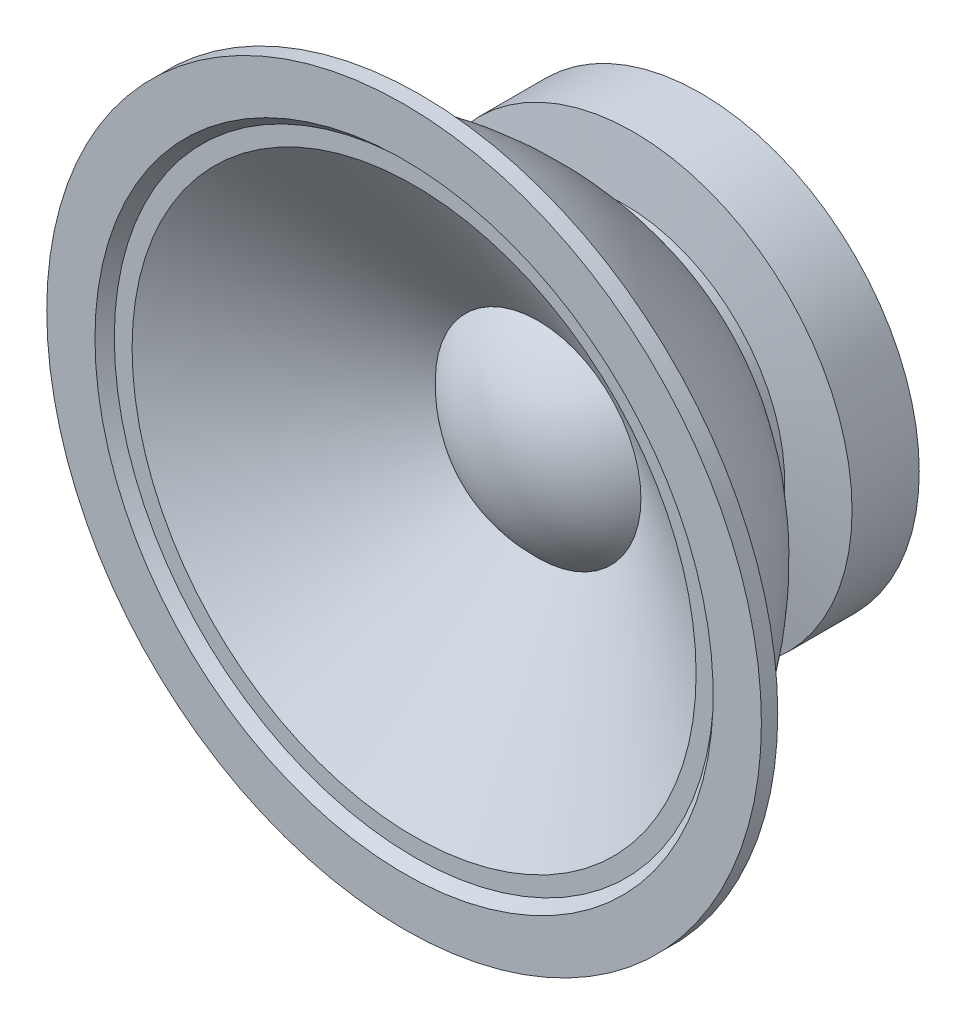
ISO-10303-21;
HEADER;
FILE_DESCRIPTION(('STEP AP214'),'2;1');
FILE_NAME('part.step','',(''),(''),'','','');
FILE_SCHEMA(('AUTOMOTIVE_DESIGN { 1 0 10303 214 1 1 1 1 }'));
ENDSEC;
DATA;
#1=APPLICATION_CONTEXT('core data for automotive mechanical design processes');
#2=APPLICATION_PROTOCOL_DEFINITION('international standard','automotive_design',2000,#1);
#3=PRODUCT_CONTEXT('',#1,'mechanical');
#4=PRODUCT('Part','Part','',(#3));
#5=PRODUCT_RELATED_PRODUCT_CATEGORY('part','',(#4));
#6=PRODUCT_DEFINITION_FORMATION('','',#4);
#7=PRODUCT_DEFINITION_CONTEXT('part definition',#1,'design');
#8=PRODUCT_DEFINITION('design','',#6,#7);
#9=PRODUCT_DEFINITION_SHAPE('','',#8);
#10=(LENGTH_UNIT() NAMED_UNIT(*) SI_UNIT(.MILLI.,.METRE.));
#11=(NAMED_UNIT(*) PLANE_ANGLE_UNIT() SI_UNIT($,.RADIAN.));
#12=(NAMED_UNIT(*) SI_UNIT($,.STERADIAN.) SOLID_ANGLE_UNIT());
#13=UNCERTAINTY_MEASURE_WITH_UNIT(LENGTH_MEASURE(1.E-05),#10,'distance_accuracy_value','');
#14=(GEOMETRIC_REPRESENTATION_CONTEXT(3) GLOBAL_UNCERTAINTY_ASSIGNED_CONTEXT((#13)) GLOBAL_UNIT_ASSIGNED_CONTEXT((#10,
#11,#12)) REPRESENTATION_CONTEXT('',''));
#15=CARTESIAN_POINT('',(0.,0.,0.));
#16=DIRECTION('',(0.,0.,1.));
#17=DIRECTION('',(1.,0.,0.));
#18=AXIS2_PLACEMENT_3D('',#15,#16,#17);
#19=CARTESIAN_POINT('',(0.,0.,-173.99));
#20=DIRECTION('',(0.,0.,1.));
#21=DIRECTION('',(1.,0.,0.));
#22=AXIS2_PLACEMENT_3D('',#19,#20,#21);
#23=PLANE('',#22);
#24=CARTESIAN_POINT('',(0.,0.,-173.99));
#25=DIRECTION('',(0.,0.,-1.));
#26=DIRECTION('',(-1.,0.,0.));
#27=AXIS2_PLACEMENT_3D('',#24,#25,#26);
#28=CIRCLE('',#27,34.441352467445);
#29=CARTESIAN_POINT('',(34.4413524674449,0.,-173.99));
#30=VERTEX_POINT('',#29);
#31=EDGE_CURVE('E10',#30,#30,#28,.T.);
#32=ORIENTED_EDGE('',*,*,#31,.T.);
#33=EDGE_LOOP('',(#32));
#34=FACE_BOUND('',#33,.T.);
#35=ADVANCED_FACE('F37',(#34),#23,.F.);
#36=CARTESIAN_POINT('',(0.,0.,-163.445094543552));
#37=DIRECTION('',(0.,0.,1.));
#38=DIRECTION('',(1.,0.,0.));
#39=AXIS2_PLACEMENT_3D('',#36,#37,#38);
#40=CONICAL_SURFACE('',#39,120.362804334795,1.44867971687013);
#41=CARTESIAN_POINT('',(0.,0.,-163.445094543552));
#42=DIRECTION('',(0.,0.,-1.));
#43=DIRECTION('',(-1.,0.,0.));
#44=AXIS2_PLACEMENT_3D('',#41,#42,#43);
#45=CIRCLE('',#44,120.362804334795);
#46=CARTESIAN_POINT('',(120.362804334795,0.,-163.445094543552));
#47=VERTEX_POINT('',#46);
#48=EDGE_CURVE('E44',#47,#47,#45,.T.);
#49=CARTESIAN_POINT('',(34.4413524674449,0.,-173.99));
#50=CARTESIAN_POINT('',(35.3363675910631,0.,-173.880157234829));
#51=CARTESIAN_POINT('',(36.2313827146814,0.,-173.770314469657));
#52=CARTESIAN_POINT('',(38.0214129619178,0.,-173.550628939315));
#53=CARTESIAN_POINT('',(38.916428085536,0.,-173.440786174143));
#54=CARTESIAN_POINT('',(40.7064583327725,0.,-173.221100643801));
#55=CARTESIAN_POINT('',(41.6014734563907,0.,-173.111257878629));
#56=CARTESIAN_POINT('',(43.3915037036272,0.,-172.891572348287));
#57=CARTESIAN_POINT('',(44.2865188272454,0.,-172.781729583115));
#58=CARTESIAN_POINT('',(46.0765490744819,0.,-172.562044052773));
#59=CARTESIAN_POINT('',(46.9715641981001,0.,-172.452201287601));
#60=CARTESIAN_POINT('',(48.7615944453366,0.,-172.232515757259));
#61=CARTESIAN_POINT('',(49.6566095689548,0.,-172.122672992087));
#62=CARTESIAN_POINT('',(51.4466398161913,0.,-171.902987461745));
#63=CARTESIAN_POINT('',(52.3416549398095,0.,-171.793144696573));
#64=CARTESIAN_POINT('',(54.131685187046,0.,-171.573459166231));
#65=CARTESIAN_POINT('',(55.0267003106642,0.,-171.463616401059));
#66=CARTESIAN_POINT('',(56.8167305579007,0.,-171.243930870717));
#67=CARTESIAN_POINT('',(57.7117456815189,0.,-171.134088105545));
#68=CARTESIAN_POINT('',(59.5017759287554,0.,-170.914402575203));
#69=CARTESIAN_POINT('',(60.3967910523736,0.,-170.804559810031));
#70=CARTESIAN_POINT('',(62.18682129961,0.,-170.584874279689));
#71=CARTESIAN_POINT('',(63.0818364232283,0.,-170.475031514518));
#72=CARTESIAN_POINT('',(64.8718666704647,0.,-170.255345984175));
#73=CARTESIAN_POINT('',(65.766881794083,0.,-170.145503219004));
#74=CARTESIAN_POINT('',(67.5569120413194,0.,-169.925817688661));
#75=CARTESIAN_POINT('',(68.4519271649377,0.,-169.81597492349));
#76=CARTESIAN_POINT('',(70.2419574121741,0.,-169.596289393147));
#77=CARTESIAN_POINT('',(71.1369725357924,0.,-169.486446627976));
#78=CARTESIAN_POINT('',(72.9270027830288,0.,-169.266761097633));
#79=CARTESIAN_POINT('',(73.822017906647,0.,-169.156918332462));
#80=CARTESIAN_POINT('',(75.6120481538835,0.,-168.937232802119));
#81=CARTESIAN_POINT('',(76.5070632775017,0.,-168.827390036948));
#82=CARTESIAN_POINT('',(78.2970935247382,0.,-168.607704506605));
#83=CARTESIAN_POINT('',(79.1921086483564,0.,-168.497861741434));
#84=CARTESIAN_POINT('',(80.9821388955929,0.,-168.278176211091));
#85=CARTESIAN_POINT('',(81.8771540192111,0.,-168.16833344592));
#86=CARTESIAN_POINT('',(83.6671842664476,0.,-167.948647915577));
#87=CARTESIAN_POINT('',(84.5621993900658,0.,-167.838805150406));
#88=CARTESIAN_POINT('',(86.3522296373023,0.,-167.619119620063));
#89=CARTESIAN_POINT('',(87.2472447609205,0.,-167.509276854892));
#90=CARTESIAN_POINT('',(89.037275008157,0.,-167.289591324549));
#91=CARTESIAN_POINT('',(89.9322901317752,0.,-167.179748559378));
#92=CARTESIAN_POINT('',(91.7223203790116,0.,-166.960063029035));
#93=CARTESIAN_POINT('',(92.6173355026299,0.,-166.850220263864));
#94=CARTESIAN_POINT('',(94.4073657498663,0.,-166.630534733521));
#95=CARTESIAN_POINT('',(95.3023808734846,0.,-166.52069196835));
#96=CARTESIAN_POINT('',(97.0924111207211,0.,-166.301006438007));
#97=CARTESIAN_POINT('',(97.9874262443393,0.,-166.191163672836));
#98=CARTESIAN_POINT('',(99.7774564915757,0.,-165.971478142493));
#99=CARTESIAN_POINT('',(100.672471615194,0.,-165.861635377322));
#100=CARTESIAN_POINT('',(102.46250186243,0.,-165.641949846979));
#101=CARTESIAN_POINT('',(103.357516986049,0.,-165.532107081808));
#102=CARTESIAN_POINT('',(105.147547233285,0.,-165.312421551465));
#103=CARTESIAN_POINT('',(106.042562356903,0.,-165.202578786294));
#104=CARTESIAN_POINT('',(107.83259260414,0.,-164.982893255951));
#105=CARTESIAN_POINT('',(108.727607727758,0.,-164.87305049078));
#106=CARTESIAN_POINT('',(110.517637974994,0.,-164.653364960437));
#107=CARTESIAN_POINT('',(111.412653098613,0.,-164.543522195266));
#108=CARTESIAN_POINT('',(113.202683345849,0.,-164.323836664923));
#109=CARTESIAN_POINT('',(114.097698469467,0.,-164.213993899752));
#110=CARTESIAN_POINT('',(115.887728716704,0.,-163.994308369409));
#111=CARTESIAN_POINT('',(116.782743840322,0.,-163.884465604238));
#112=CARTESIAN_POINT('',(118.572774087559,0.,-163.664780073895));
#113=CARTESIAN_POINT('',(119.467789211177,0.,-163.554937308724));
#114=CARTESIAN_POINT('',(120.362804334795,0.,-163.445094543552));
#115=B_SPLINE_CURVE_WITH_KNOTS('',3,(#49,#50,#51,#52,#53,#54,#55,#56,#57,#58,#59,#60,#61,#62,
#63,#64,#65,#66,#67,#68,#69,#70,#71,#72,#73,#74,#75,#76,#77,#78,#79,#80,#81,#82,#83,#84,#85,#86,
#87,#88,#89,#90,#91,#92,#93,#94,#95,#96,#97,#98,#99,#100,#101,#102,#103,#104,#105,#106,#107,
#108,#109,#110,#111,#112,#113,#114),.UNSPECIFIED.,.F.,.F.,(4,2,2,2,2,2,2,2,2,2,2,2,2,2,2,2,2,2,
2,2,2,2,2,2,2,2,2,2,2,2,2,2,4),(0.,2.70519085114018,5.41038170228037,8.11557255342057,
10.8207634045607,13.5259542557009,16.2311451068411,18.9363359579813,21.6415268091215,
24.3467176602617,27.0519085114019,29.757099362542,32.4622902136822,35.1674810648224,
37.8726719159626,40.5778627671028,43.283053618243,45.9882444693832,48.6934353205233,
51.3986261716635,54.1038170228037,56.8090078739439,59.5141987250841,62.2193895762243,
64.9245804273645,67.6297712785046,70.3349621296448,73.040152980785,75.7453438319252,
78.4505346830654,81.1557255342056,83.8609163853457,86.5661072364859),.UNSPECIFIED.);
#116=EDGE_CURVE('BSEAM105',#30,#47,#115,.T.);
#117=ORIENTED_EDGE('',*,*,#31,.F.);
#118=ORIENTED_EDGE('',*,*,#48,.T.);
#119=ORIENTED_EDGE('',*,*,#116,.T.);
#120=ORIENTED_EDGE('',*,*,#116,.F.);
#121=EDGE_LOOP('',(#117,#119,#118,#120));
#122=FACE_BOUND('',#121,.T.);
#123=ADVANCED_FACE('F105',(#122),#40,.T.);
#124=CARTESIAN_POINT('',(0.,0.,-173.99));
#125=DIRECTION('',(0.,0.,-1.));
#126=DIRECTION('',(-1.,0.,0.));
#127=AXIS2_PLACEMENT_3D('',#124,#125,#126);
#128=CYLINDRICAL_SURFACE('',#127,120.362804334795);
#129=ORIENTED_EDGE('',*,*,#48,.F.);
#130=EDGE_LOOP('',(#129));
#131=FACE_BOUND('',#130,.T.);
#132=CARTESIAN_POINT('',(0.,0.,-126.418045415359));
#133=DIRECTION('',(0.,0.,-1.));
#134=DIRECTION('',(-1.,0.,0.));
#135=AXIS2_PLACEMENT_3D('',#132,#133,#134);
#136=CIRCLE('',#135,120.362804334795);
#137=CARTESIAN_POINT('',(-120.362804334795,0.,-126.418045415359));
#138=VERTEX_POINT('',#137);
#139=EDGE_CURVE('E49',#138,#138,#136,.T.);
#140=ORIENTED_EDGE('',*,*,#139,.T.);
#141=EDGE_LOOP('',(#140));
#142=FACE_BOUND('',#141,.T.);
#143=ADVANCED_FACE('F109',(#131,#142),#128,.T.);
#144=CARTESIAN_POINT('',(0.,0.,-121.717541751532));
#145=DIRECTION('',(0.,0.,-1.));
#146=DIRECTION('',(-1.,0.,0.));
#147=AXIS2_PLACEMENT_3D('',#144,#145,#146);
#148=CONICAL_SURFACE('',#147,87.9302066261031,1.4268670365853);
#149=ORIENTED_EDGE('',*,*,#139,.F.);
#150=EDGE_LOOP('',(#149));
#151=FACE_BOUND('',#150,.T.);
#152=CARTESIAN_POINT('',(0.,0.,-121.717541751532));
#153=DIRECTION('',(0.,0.,-1.));
#154=DIRECTION('',(-1.,0.,0.));
#155=AXIS2_PLACEMENT_3D('',#152,#153,#154);
#156=CIRCLE('',#155,87.9302066261031);
#157=CARTESIAN_POINT('',(-87.9302066261031,0.,-121.717541751532));
#158=VERTEX_POINT('',#157);
#159=EDGE_CURVE('E54',#158,#158,#156,.T.);
#160=ORIENTED_EDGE('',*,*,#159,.T.);
#161=EDGE_LOOP('',(#160));
#162=FACE_BOUND('',#161,.T.);
#163=ADVANCED_FACE('F114',(#151,#162),#148,.T.);
#164=CARTESIAN_POINT('',(0.,0.,-173.99));
#165=DIRECTION('',(0.,0.,-1.));
#166=DIRECTION('',(-1.,0.,0.));
#167=AXIS2_PLACEMENT_3D('',#164,#165,#166);
#168=CYLINDRICAL_SURFACE('',#167,87.9302066261031);
#169=ORIENTED_EDGE('',*,*,#159,.F.);
#170=EDGE_LOOP('',(#169));
#171=FACE_BOUND('',#170,.T.);
#172=CARTESIAN_POINT('',(0.,0.,-116.489255163204));
#173=DIRECTION('',(0.,0.,-1.));
#174=DIRECTION('',(-1.,0.,0.));
#175=AXIS2_PLACEMENT_3D('',#172,#173,#174);
#176=CIRCLE('',#175,87.9302066261031);
#177=CARTESIAN_POINT('',(-87.9302066261031,0.,-116.489255163204));
#178=VERTEX_POINT('',#177);
#179=EDGE_CURVE('E60',#178,#178,#176,.T.);
#180=ORIENTED_EDGE('',*,*,#179,.T.);
#181=EDGE_LOOP('',(#180));
#182=FACE_BOUND('',#181,.T.);
#183=ADVANCED_FACE('F120',(#171,#182),#168,.T.);
#184=CARTESIAN_POINT('',(0.,0.,72.7125803686714));
#185=DIRECTION('',(0.,0.,-1.));
#186=DIRECTION('',(-1.,0.,0.));
#187=AXIS2_PLACEMENT_3D('',#184,#185,#186);
#188=DEGENERATE_TOROIDAL_SURFACE('',#187,32.0993716058547,224.063460249932,.F.);
#189=ORIENTED_EDGE('',*,*,#179,.F.);
#190=EDGE_LOOP('',(#189));
#191=FACE_BOUND('',#190,.T.);
#192=CARTESIAN_POINT('',(0.,0.,-9.00779360574744));
#193=DIRECTION('',(0.,0.,-1.));
#194=DIRECTION('',(-1.,0.,0.));
#195=AXIS2_PLACEMENT_3D('',#192,#193,#194);
#196=CIRCLE('',#195,176.53);
#197=CARTESIAN_POINT('',(-176.53,0.,-9.00779360574744));
#198=VERTEX_POINT('',#197);
#199=EDGE_CURVE('E64',#198,#198,#196,.T.);
#200=ORIENTED_EDGE('',*,*,#199,.T.);
#201=EDGE_LOOP('',(#200));
#202=FACE_BOUND('',#201,.T.);
#203=ADVANCED_FACE('F124',(#191,#202),#188,.F.);
#204=CARTESIAN_POINT('',(176.53,0.,-9.00779360574742));
#205=DIRECTION('',(0.,0.,1.));
#206=DIRECTION('',(1.,0.,0.));
#207=AXIS2_PLACEMENT_3D('',#204,#205,#206);
#208=PLANE('',#207);
#209=ORIENTED_EDGE('',*,*,#199,.F.);
#210=EDGE_LOOP('',(#209));
#211=FACE_BOUND('',#210,.T.);
#212=CARTESIAN_POINT('',(0.,0.,-9.00779360574741));
#213=DIRECTION('',(0.,0.,-1.));
#214=DIRECTION('',(-1.,0.,0.));
#215=AXIS2_PLACEMENT_3D('',#212,#213,#214);
#216=CIRCLE('',#215,196.85);
#217=CARTESIAN_POINT('',(-196.85,0.,-9.00779360574741));
#218=VERTEX_POINT('',#217);
#219=EDGE_CURVE('E68',#218,#218,#216,.T.);
#220=ORIENTED_EDGE('',*,*,#219,.T.);
#221=EDGE_LOOP('',(#220));
#222=FACE_BOUND('',#221,.T.);
#223=ADVANCED_FACE('F128',(#211,#222),#208,.F.);
#224=CARTESIAN_POINT('',(0.,0.,-173.99));
#225=DIRECTION('',(0.,0.,-1.));
#226=DIRECTION('',(-1.,0.,0.));
#227=AXIS2_PLACEMENT_3D('',#224,#225,#226);
#228=CYLINDRICAL_SURFACE('',#227,196.85);
#229=ORIENTED_EDGE('',*,*,#219,.F.);
#230=EDGE_LOOP('',(#229));
#231=FACE_BOUND('',#230,.T.);
#232=CARTESIAN_POINT('',(0.,0.,0.));
#233=DIRECTION('',(0.,0.,-1.));
#234=DIRECTION('',(-1.,0.,0.));
#235=AXIS2_PLACEMENT_3D('',#232,#233,#234);
#236=CIRCLE('',#235,196.85);
#237=CARTESIAN_POINT('',(-196.85,0.,0.));
#238=VERTEX_POINT('',#237);
#239=EDGE_CURVE('E72',#238,#238,#236,.T.);
#240=ORIENTED_EDGE('',*,*,#239,.T.);
#241=EDGE_LOOP('',(#240));
#242=FACE_BOUND('',#241,.T.);
#243=ADVANCED_FACE('F132',(#231,#242),#228,.T.);
#244=CARTESIAN_POINT('',(196.85,0.,0.));
#245=DIRECTION('',(0.,0.,-1.));
#246=DIRECTION('',(-1.,0.,0.));
#247=AXIS2_PLACEMENT_3D('',#244,#245,#246);
#248=PLANE('',#247);
#249=ORIENTED_EDGE('',*,*,#239,.F.);
#250=EDGE_LOOP('',(#249));
#251=FACE_BOUND('',#250,.T.);
#252=CARTESIAN_POINT('',(0.,0.,0.));
#253=DIRECTION('',(0.,0.,-1.));
#254=DIRECTION('',(-1.,0.,0.));
#255=AXIS2_PLACEMENT_3D('',#252,#253,#254);
#256=CIRCLE('',#255,170.287454318281);
#257=CARTESIAN_POINT('',(-170.287454318281,0.,0.));
#258=VERTEX_POINT('',#257);
#259=EDGE_CURVE('E76',#258,#258,#256,.T.);
#260=ORIENTED_EDGE('',*,*,#259,.T.);
#261=EDGE_LOOP('',(#260));
#262=FACE_BOUND('',#261,.T.);
#263=ADVANCED_FACE('F136',(#251,#262),#248,.F.);
#264=CARTESIAN_POINT('',(0.,0.,-5.51904113147772));
#265=DIRECTION('',(0.,0.,1.));
#266=DIRECTION('',(1.,0.,0.));
#267=AXIS2_PLACEMENT_3D('',#264,#265,#266);
#268=CONICAL_SURFACE('',#267,165.146134882515,0.749980623641465);
#269=ORIENTED_EDGE('',*,*,#259,.F.);
#270=EDGE_LOOP('',(#269));
#271=FACE_BOUND('',#270,.T.);
#272=CARTESIAN_POINT('',(0.,0.,-5.51904113147772));
#273=DIRECTION('',(0.,0.,-1.));
#274=DIRECTION('',(-1.,0.,0.));
#275=AXIS2_PLACEMENT_3D('',#272,#273,#274);
#276=CIRCLE('',#275,165.146134882515);
#277=CARTESIAN_POINT('',(-165.146134882515,0.,-5.51904113147772));
#278=VERTEX_POINT('',#277);
#279=EDGE_CURVE('E80',#278,#278,#276,.T.);
#280=ORIENTED_EDGE('',*,*,#279,.T.);
#281=EDGE_LOOP('',(#280));
#282=FACE_BOUND('',#281,.T.);
#283=ADVANCED_FACE('F140',(#271,#282),#268,.F.);
#284=CARTESIAN_POINT('',(165.146134882515,0.,-5.51904113147771));
#285=DIRECTION('',(0.,0.,-1.));
#286=DIRECTION('',(-1.,0.,0.));
#287=AXIS2_PLACEMENT_3D('',#284,#285,#286);
#288=PLANE('',#287);
#289=ORIENTED_EDGE('',*,*,#279,.F.);
#290=EDGE_LOOP('',(#289));
#291=FACE_BOUND('',#290,.T.);
#292=CARTESIAN_POINT('',(0.,0.,-5.51904113147769));
#293=DIRECTION('',(0.,0.,-1.));
#294=DIRECTION('',(-1.,0.,0.));
#295=AXIS2_PLACEMENT_3D('',#292,#293,#294);
#296=CIRCLE('',#295,155.357244635368);
#297=CARTESIAN_POINT('',(-155.357244635368,0.,-5.51904113147769));
#298=VERTEX_POINT('',#297);
#299=EDGE_CURVE('E84',#298,#298,#296,.T.);
#300=ORIENTED_EDGE('',*,*,#299,.T.);
#301=EDGE_LOOP('',(#300));
#302=FACE_BOUND('',#301,.T.);
#303=ADVANCED_FACE('F101',(#291,#302),#288,.F.);
#304=CARTESIAN_POINT('',(0.,0.,-73.8595024968564));
#305=DIRECTION('',(0.,0.,1.));
#306=DIRECTION('',(1.,0.,0.));
#307=AXIS2_PLACEMENT_3D('',#304,#305,#306);
#308=CONICAL_SURFACE('',#307,56.6350007812884,0.965290746024293);
#309=ORIENTED_EDGE('',*,*,#299,.F.);
#310=EDGE_LOOP('',(#309));
#311=FACE_BOUND('',#310,.T.);
#312=CARTESIAN_POINT('',(0.,0.,-73.8595024968564));
#313=DIRECTION('',(0.,0.,-1.));
#314=DIRECTION('',(-1.,0.,0.));
#315=AXIS2_PLACEMENT_3D('',#312,#313,#314);
#316=CIRCLE('',#315,56.6350007812884);
#317=CARTESIAN_POINT('',(-56.6350007812884,0.,-73.8595024968564));
#318=VERTEX_POINT('',#317);
#319=EDGE_CURVE('E88',#318,#318,#316,.T.);
#320=ORIENTED_EDGE('',*,*,#319,.T.);
#321=EDGE_LOOP('',(#320));
#322=FACE_BOUND('',#321,.T.);
#323=ADVANCED_FACE('F93',(#311,#322),#308,.F.);
#324=CARTESIAN_POINT('',(0.,0.,-126.418045415359));
#325=DIRECTION('',(0.,0.,-1.));
#326=DIRECTION('',(1.,0.,0.));
#327=AXIS2_PLACEMENT_3D('',#324,#325,#326);
#328=SPHERICAL_SURFACE('',#327,77.2652816419679);
#329=ORIENTED_EDGE('',*,*,#319,.F.);
#330=EDGE_LOOP('',(#329));
#331=FACE_BOUND('',#330,.T.);
#332=ADVANCED_FACE('F95',(#331),#328,.T.);
#333=CLOSED_SHELL('',(#35,#123,#143,#163,#183,#203,#223,#243,#263,#283,#303,#323,#332));
#334=MANIFOLD_SOLID_BREP('B2',#333);
#335=ADVANCED_BREP_SHAPE_REPRESENTATION('',(#18,#334),#14);
#336=SHAPE_DEFINITION_REPRESENTATION(#9,#335);
ENDSEC;
END-ISO-10303-21;
